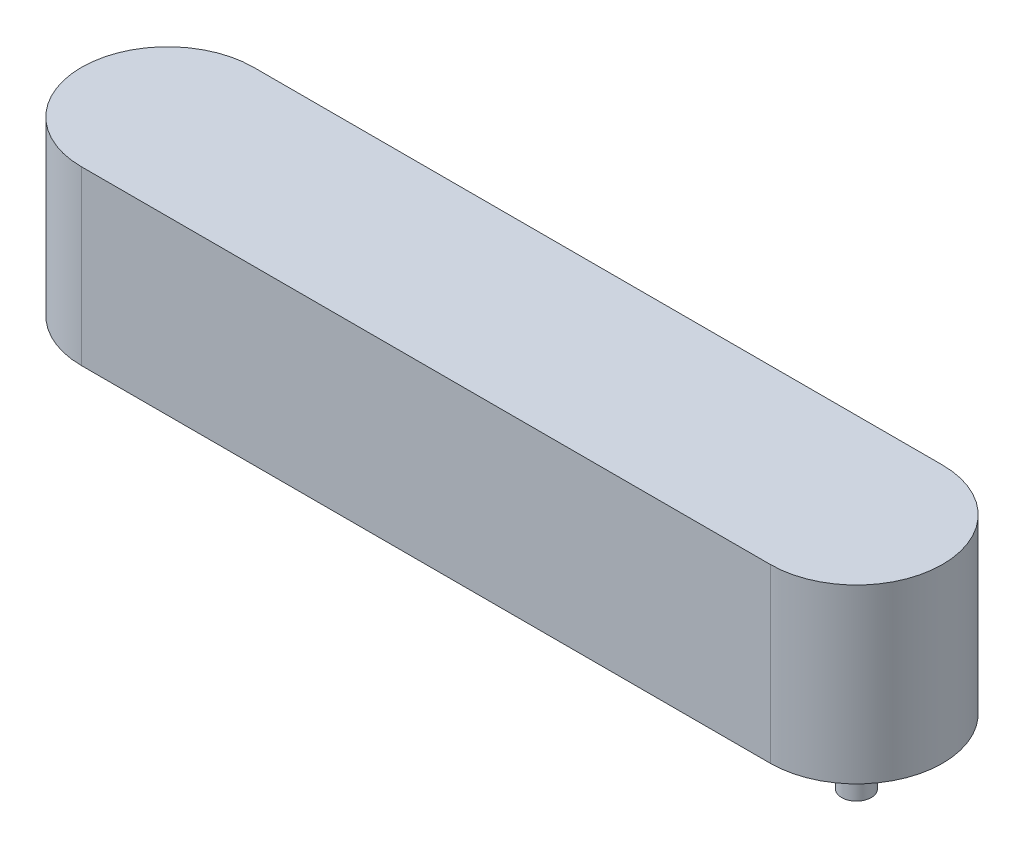
ISO-10303-21;
HEADER;
FILE_DESCRIPTION(('STEP AP214'),'2;1');
FILE_NAME('part.step','',(''),(''),'','','');
FILE_SCHEMA(('AUTOMOTIVE_DESIGN { 1 0 10303 214 1 1 1 1 }'));
ENDSEC;
DATA;
#1=APPLICATION_CONTEXT('core data for automotive mechanical design processes');
#2=APPLICATION_PROTOCOL_DEFINITION('international standard','automotive_design',2000,#1);
#3=PRODUCT_CONTEXT('',#1,'mechanical');
#4=PRODUCT('Part','Part','',(#3));
#5=PRODUCT_RELATED_PRODUCT_CATEGORY('part','',(#4));
#6=PRODUCT_DEFINITION_FORMATION('','',#4);
#7=PRODUCT_DEFINITION_CONTEXT('part definition',#1,'design');
#8=PRODUCT_DEFINITION('design','',#6,#7);
#9=PRODUCT_DEFINITION_SHAPE('','',#8);
#10=(LENGTH_UNIT() NAMED_UNIT(*) SI_UNIT(.MILLI.,.METRE.));
#11=(NAMED_UNIT(*) PLANE_ANGLE_UNIT() SI_UNIT($,.RADIAN.));
#12=(NAMED_UNIT(*) SI_UNIT($,.STERADIAN.) SOLID_ANGLE_UNIT());
#13=UNCERTAINTY_MEASURE_WITH_UNIT(LENGTH_MEASURE(1.E-05),#10,'distance_accuracy_value','');
#14=(GEOMETRIC_REPRESENTATION_CONTEXT(3) GLOBAL_UNCERTAINTY_ASSIGNED_CONTEXT((#13)) GLOBAL_UNIT_ASSIGNED_CONTEXT((#10,
#11,#12)) REPRESENTATION_CONTEXT('',''));
#15=CARTESIAN_POINT('',(0.,0.,0.));
#16=DIRECTION('',(0.,0.,1.));
#17=DIRECTION('',(1.,0.,0.));
#18=AXIS2_PLACEMENT_3D('',#15,#16,#17);
#19=CARTESIAN_POINT('',(-5.8,1.45,0.));
#20=DIRECTION('',(0.,-1.,0.));
#21=DIRECTION('',(0.,0.,-1.));
#22=AXIS2_PLACEMENT_3D('',#19,#20,#21);
#23=CYLINDRICAL_SURFACE('',#22,1.45);
#24=DIRECTION('',(0.,1.,0.));
#25=VECTOR('',#24,1.);
#26=CARTESIAN_POINT('',(-5.8,1.45,1.45));
#27=LINE('',#26,#25);
#28=CARTESIAN_POINT('',(-5.8,1.45,1.45));
#29=VERTEX_POINT('',#28);
#30=CARTESIAN_POINT('',(-5.8,-1.45,1.45));
#31=VERTEX_POINT('',#30);
#32=EDGE_CURVE('E119',#29,#31,#27,.F.);
#33=ORIENTED_EDGE('',*,*,#32,.F.);
#34=CARTESIAN_POINT('',(-5.8,1.45,0.));
#35=DIRECTION('',(0.,-1.,0.));
#36=DIRECTION('',(0.,0.,-1.));
#37=AXIS2_PLACEMENT_3D('',#34,#35,#36);
#38=CIRCLE('',#37,1.45);
#39=CARTESIAN_POINT('',(-5.8,1.45,-1.45));
#40=VERTEX_POINT('',#39);
#41=EDGE_CURVE('E67',#40,#29,#38,.F.);
#42=ORIENTED_EDGE('',*,*,#41,.F.);
#43=DIRECTION('',(0.,-1.,0.));
#44=VECTOR('',#43,1.);
#45=CARTESIAN_POINT('',(-5.8,0.,-1.45));
#46=LINE('',#45,#44);
#47=CARTESIAN_POINT('',(-5.8,-1.45,-1.45));
#48=VERTEX_POINT('',#47);
#49=EDGE_CURVE('E108',#48,#40,#46,.F.);
#50=ORIENTED_EDGE('',*,*,#49,.F.);
#51=CARTESIAN_POINT('',(-5.8,-1.45,0.));
#52=DIRECTION('',(0.,1.,0.));
#53=DIRECTION('',(0.,0.,1.));
#54=AXIS2_PLACEMENT_3D('',#51,#52,#53);
#55=CIRCLE('',#54,1.45);
#56=EDGE_CURVE('E60',#31,#48,#55,.F.);
#57=ORIENTED_EDGE('',*,*,#56,.F.);
#58=EDGE_LOOP('',(#33,#42,#50,#57));
#59=FACE_BOUND('',#58,.T.);
#60=ADVANCED_FACE('F45',(#59),#23,.T.);
#61=CARTESIAN_POINT('',(5.8,1.45,0.));
#62=DIRECTION('',(0.,1.,0.));
#63=DIRECTION('',(0.,0.,1.));
#64=AXIS2_PLACEMENT_3D('',#61,#62,#63);
#65=CYLINDRICAL_SURFACE('',#64,1.45);
#66=DIRECTION('',(0.,1.,0.));
#67=VECTOR('',#66,1.);
#68=CARTESIAN_POINT('',(5.8,0.,-1.45));
#69=LINE('',#68,#67);
#70=CARTESIAN_POINT('',(5.8,1.45,-1.45));
#71=VERTEX_POINT('',#70);
#72=CARTESIAN_POINT('',(5.8,-1.45,-1.45));
#73=VERTEX_POINT('',#72);
#74=EDGE_CURVE('E101',#71,#73,#69,.F.);
#75=ORIENTED_EDGE('',*,*,#74,.F.);
#76=CARTESIAN_POINT('',(5.8,1.45,0.));
#77=DIRECTION('',(0.,-1.,0.));
#78=DIRECTION('',(0.,0.,-1.));
#79=AXIS2_PLACEMENT_3D('',#76,#77,#78);
#80=CIRCLE('',#79,1.45);
#81=CARTESIAN_POINT('',(5.8,1.45,1.45));
#82=VERTEX_POINT('',#81);
#83=EDGE_CURVE('E86',#82,#71,#80,.F.);
#84=ORIENTED_EDGE('',*,*,#83,.F.);
#85=DIRECTION('',(0.,-1.,0.));
#86=VECTOR('',#85,1.);
#87=CARTESIAN_POINT('',(5.8,1.45,1.45));
#88=LINE('',#87,#86);
#89=CARTESIAN_POINT('',(5.8,-1.45,1.45));
#90=VERTEX_POINT('',#89);
#91=EDGE_CURVE('E97',#90,#82,#88,.F.);
#92=ORIENTED_EDGE('',*,*,#91,.F.);
#93=CARTESIAN_POINT('',(5.8,-1.45,0.));
#94=DIRECTION('',(0.,1.,0.));
#95=DIRECTION('',(0.,0.,1.));
#96=AXIS2_PLACEMENT_3D('',#93,#94,#95);
#97=CIRCLE('',#96,1.45);
#98=EDGE_CURVE('E96',#73,#90,#97,.F.);
#99=ORIENTED_EDGE('',*,*,#98,.F.);
#100=EDGE_LOOP('',(#75,#84,#92,#99));
#101=FACE_BOUND('',#100,.T.);
#102=ADVANCED_FACE('F102',(#101),#65,.T.);
#103=CARTESIAN_POINT('',(-7.25,-1.45,1.45));
#104=DIRECTION('',(0.,1.,0.));
#105=DIRECTION('',(0.,0.,1.));
#106=AXIS2_PLACEMENT_3D('',#103,#104,#105);
#107=PLANE('',#106);
#108=CARTESIAN_POINT('',(5.8,-1.45,0.));
#109=DIRECTION('',(0.,1.,0.));
#110=DIRECTION('',(0.,0.,1.));
#111=AXIS2_PLACEMENT_3D('',#108,#109,#110);
#112=CIRCLE('',#111,0.25);
#113=CARTESIAN_POINT('',(5.8,-1.45,0.25));
#114=VERTEX_POINT('',#113);
#115=EDGE_CURVE('E12',#114,#114,#112,.F.);
#116=ORIENTED_EDGE('',*,*,#115,.F.);
#117=EDGE_LOOP('',(#116));
#118=FACE_BOUND('',#117,.T.);
#119=CARTESIAN_POINT('',(-5.8,-1.45,0.));
#120=DIRECTION('',(0.,1.,0.));
#121=DIRECTION('',(0.,0.,1.));
#122=AXIS2_PLACEMENT_3D('',#119,#120,#121);
#123=CIRCLE('',#122,0.25);
#124=CARTESIAN_POINT('',(-5.8,-1.45,0.25));
#125=VERTEX_POINT('',#124);
#126=EDGE_CURVE('E53',#125,#125,#123,.F.);
#127=ORIENTED_EDGE('',*,*,#126,.F.);
#128=EDGE_LOOP('',(#127));
#129=FACE_BOUND('',#128,.T.);
#130=DIRECTION('',(1.,0.,0.));
#131=VECTOR('',#130,1.);
#132=CARTESIAN_POINT('',(-7.25,-1.45,1.45));
#133=LINE('',#132,#131);
#134=EDGE_CURVE('E109',#31,#90,#133,.T.);
#135=ORIENTED_EDGE('',*,*,#134,.F.);
#136=ORIENTED_EDGE('',*,*,#56,.T.);
#137=DIRECTION('',(1.,0.,0.));
#138=VECTOR('',#137,1.);
#139=CARTESIAN_POINT('',(-7.25,-1.45,-1.45));
#140=LINE('',#139,#138);
#141=EDGE_CURVE('E110',#48,#73,#140,.T.);
#142=ORIENTED_EDGE('',*,*,#141,.T.);
#143=ORIENTED_EDGE('',*,*,#98,.T.);
#144=EDGE_LOOP('',(#135,#136,#142,#143));
#145=FACE_BOUND('',#144,.T.);
#146=ADVANCED_FACE('F130',(#118,#129,#145),#107,.F.);
#147=CARTESIAN_POINT('',(-7.25,1.45,1.45));
#148=DIRECTION('',(0.,-1.,0.));
#149=DIRECTION('',(0.,0.,-1.));
#150=AXIS2_PLACEMENT_3D('',#147,#148,#149);
#151=PLANE('',#150);
#152=DIRECTION('',(-1.,0.,0.));
#153=VECTOR('',#152,1.);
#154=CARTESIAN_POINT('',(-7.25,1.45,-1.45));
#155=LINE('',#154,#153);
#156=EDGE_CURVE('E90',#71,#40,#155,.T.);
#157=ORIENTED_EDGE('',*,*,#156,.T.);
#158=ORIENTED_EDGE('',*,*,#41,.T.);
#159=DIRECTION('',(-1.,0.,0.));
#160=VECTOR('',#159,1.);
#161=CARTESIAN_POINT('',(-7.25,1.45,1.45));
#162=LINE('',#161,#160);
#163=EDGE_CURVE('E92',#82,#29,#162,.T.);
#164=ORIENTED_EDGE('',*,*,#163,.F.);
#165=ORIENTED_EDGE('',*,*,#83,.T.);
#166=EDGE_LOOP('',(#157,#158,#164,#165));
#167=FACE_BOUND('',#166,.T.);
#168=ADVANCED_FACE('F88',(#167),#151,.F.);
#169=CARTESIAN_POINT('',(0.,0.,1.45));
#170=DIRECTION('',(0.,0.,1.));
#171=DIRECTION('',(1.,0.,0.));
#172=AXIS2_PLACEMENT_3D('',#169,#170,#171);
#173=PLANE('',#172);
#174=ORIENTED_EDGE('',*,*,#163,.T.);
#175=ORIENTED_EDGE('',*,*,#32,.T.);
#176=ORIENTED_EDGE('',*,*,#134,.T.);
#177=ORIENTED_EDGE('',*,*,#91,.T.);
#178=EDGE_LOOP('',(#174,#175,#176,#177));
#179=FACE_BOUND('',#178,.T.);
#180=ADVANCED_FACE('F135',(#179),#173,.T.);
#181=CARTESIAN_POINT('',(0.,0.,-1.45));
#182=DIRECTION('',(0.,0.,1.));
#183=DIRECTION('',(1.,0.,0.));
#184=AXIS2_PLACEMENT_3D('',#181,#182,#183);
#185=PLANE('',#184);
#186=ORIENTED_EDGE('',*,*,#141,.F.);
#187=ORIENTED_EDGE('',*,*,#49,.T.);
#188=ORIENTED_EDGE('',*,*,#156,.F.);
#189=ORIENTED_EDGE('',*,*,#74,.T.);
#190=EDGE_LOOP('',(#186,#187,#188,#189));
#191=FACE_BOUND('',#190,.T.);
#192=ADVANCED_FACE('F107',(#191),#185,.F.);
#193=CARTESIAN_POINT('',(-5.8,-7.25710678118655,0.));
#194=DIRECTION('',(0.,1.,0.));
#195=DIRECTION('',(0.,0.,1.));
#196=AXIS2_PLACEMENT_3D('',#193,#194,#195);
#197=CYLINDRICAL_SURFACE('',#196,0.25);
#198=ORIENTED_EDGE('',*,*,#126,.T.);
#199=EDGE_LOOP('',(#198));
#200=FACE_BOUND('',#199,.T.);
#201=CARTESIAN_POINT('',(-5.8,-2.55,0.));
#202=DIRECTION('',(0.,-1.,0.));
#203=DIRECTION('',(0.,0.,-1.));
#204=AXIS2_PLACEMENT_3D('',#201,#202,#203);
#205=CIRCLE('',#204,0.25);
#206=CARTESIAN_POINT('',(-5.8,-2.55,-0.25));
#207=VERTEX_POINT('',#206);
#208=EDGE_CURVE('E113',#207,#207,#205,.T.);
#209=ORIENTED_EDGE('',*,*,#208,.F.);
#210=EDGE_LOOP('',(#209));
#211=FACE_BOUND('',#210,.T.);
#212=ADVANCED_FACE('F127',(#200,#211),#197,.T.);
#213=CARTESIAN_POINT('',(-7.25,-2.55,1.45));
#214=DIRECTION('',(0.,-1.,0.));
#215=DIRECTION('',(0.,0.,-1.));
#216=AXIS2_PLACEMENT_3D('',#213,#214,#215);
#217=PLANE('',#216);
#218=ORIENTED_EDGE('',*,*,#208,.T.);
#219=EDGE_LOOP('',(#218));
#220=FACE_BOUND('',#219,.T.);
#221=ADVANCED_FACE('F152',(#220),#217,.T.);
#222=CARTESIAN_POINT('',(5.8,-7.25710678118655,0.));
#223=DIRECTION('',(0.,1.,0.));
#224=DIRECTION('',(0.,0.,1.));
#225=AXIS2_PLACEMENT_3D('',#222,#223,#224);
#226=CYLINDRICAL_SURFACE('',#225,0.25);
#227=ORIENTED_EDGE('',*,*,#115,.T.);
#228=EDGE_LOOP('',(#227));
#229=FACE_BOUND('',#228,.T.);
#230=CARTESIAN_POINT('',(5.8,-2.55,0.));
#231=DIRECTION('',(0.,-1.,0.));
#232=DIRECTION('',(0.,0.,-1.));
#233=AXIS2_PLACEMENT_3D('',#230,#231,#232);
#234=CIRCLE('',#233,0.25);
#235=CARTESIAN_POINT('',(5.8,-2.55,-0.25));
#236=VERTEX_POINT('',#235);
#237=EDGE_CURVE('E169',#236,#236,#234,.T.);
#238=ORIENTED_EDGE('',*,*,#237,.F.);
#239=EDGE_LOOP('',(#238));
#240=FACE_BOUND('',#239,.T.);
#241=ADVANCED_FACE('F155',(#229,#240),#226,.T.);
#242=CARTESIAN_POINT('',(-7.25,-2.55,1.45));
#243=DIRECTION('',(0.,-1.,0.));
#244=DIRECTION('',(0.,0.,-1.));
#245=AXIS2_PLACEMENT_3D('',#242,#243,#244);
#246=PLANE('',#245);
#247=ORIENTED_EDGE('',*,*,#237,.T.);
#248=EDGE_LOOP('',(#247));
#249=FACE_BOUND('',#248,.T.);
#250=ADVANCED_FACE('F161',(#249),#246,.T.);
#251=CLOSED_SHELL('',(#60,#102,#146,#168,#180,#192,#212,#221,#241,#250));
#252=MANIFOLD_SOLID_BREP('B2',#251);
#253=ADVANCED_BREP_SHAPE_REPRESENTATION('',(#18,#252),#14);
#254=SHAPE_DEFINITION_REPRESENTATION(#9,#253);
ENDSEC;
END-ISO-10303-21;
